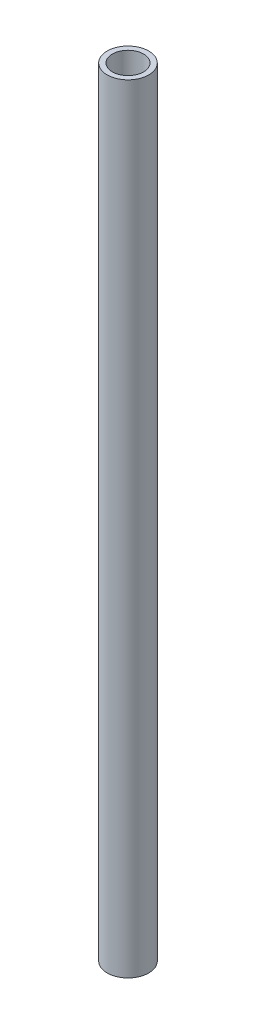
ISO-10303-21;
HEADER;
FILE_DESCRIPTION(('STEP AP214'),'2;1');
FILE_NAME('part.step','',(''),(''),'','','');
FILE_SCHEMA(('AUTOMOTIVE_DESIGN { 1 0 10303 214 1 1 1 1 }'));
ENDSEC;
DATA;
#1=APPLICATION_CONTEXT('core data for automotive mechanical design processes');
#2=APPLICATION_PROTOCOL_DEFINITION('international standard','automotive_design',2000,#1);
#3=PRODUCT_CONTEXT('',#1,'mechanical');
#4=PRODUCT('Part','Part','',(#3));
#5=PRODUCT_RELATED_PRODUCT_CATEGORY('part','',(#4));
#6=PRODUCT_DEFINITION_FORMATION('','',#4);
#7=PRODUCT_DEFINITION_CONTEXT('part definition',#1,'design');
#8=PRODUCT_DEFINITION('design','',#6,#7);
#9=PRODUCT_DEFINITION_SHAPE('','',#8);
#10=(LENGTH_UNIT() NAMED_UNIT(*) SI_UNIT(.MILLI.,.METRE.));
#11=(NAMED_UNIT(*) PLANE_ANGLE_UNIT() SI_UNIT($,.RADIAN.));
#12=(NAMED_UNIT(*) SI_UNIT($,.STERADIAN.) SOLID_ANGLE_UNIT());
#13=UNCERTAINTY_MEASURE_WITH_UNIT(LENGTH_MEASURE(1.E-05),#10,'distance_accuracy_value','');
#14=(GEOMETRIC_REPRESENTATION_CONTEXT(3) GLOBAL_UNCERTAINTY_ASSIGNED_CONTEXT((#13)) GLOBAL_UNIT_ASSIGNED_CONTEXT((#10,
#11,#12)) REPRESENTATION_CONTEXT('',''));
#15=CARTESIAN_POINT('',(0.,0.,0.));
#16=DIRECTION('',(0.,0.,1.));
#17=DIRECTION('',(1.,0.,0.));
#18=AXIS2_PLACEMENT_3D('',#15,#16,#17);
#19=CARTESIAN_POINT('',(0.,0.,0.));
#20=DIRECTION('',(0.,1.,0.));
#21=DIRECTION('',(0.,0.,1.));
#22=AXIS2_PLACEMENT_3D('',#19,#20,#21);
#23=CYLINDRICAL_SURFACE('',#22,4.);
#24=CARTESIAN_POINT('',(0.,150.,0.));
#25=DIRECTION('',(0.,1.,0.));
#26=DIRECTION('',(0.,0.,1.));
#27=AXIS2_PLACEMENT_3D('',#24,#25,#26);
#28=CIRCLE('',#27,4.);
#29=CARTESIAN_POINT('',(0.,150.,4.));
#30=VERTEX_POINT('',#29);
#31=EDGE_CURVE('E50',#30,#30,#28,.T.);
#32=ORIENTED_EDGE('',*,*,#31,.F.);
#33=EDGE_LOOP('',(#32));
#34=FACE_BOUND('',#33,.T.);
#35=CARTESIAN_POINT('',(0.,0.,0.));
#36=DIRECTION('',(0.,1.,0.));
#37=DIRECTION('',(0.,0.,1.));
#38=AXIS2_PLACEMENT_3D('',#35,#36,#37);
#39=CIRCLE('',#38,4.);
#40=CARTESIAN_POINT('',(0.,0.,4.));
#41=VERTEX_POINT('',#40);
#42=EDGE_CURVE('E35',#41,#41,#39,.T.);
#43=ORIENTED_EDGE('',*,*,#42,.T.);
#44=EDGE_LOOP('',(#43));
#45=FACE_BOUND('',#44,.T.);
#46=ADVANCED_FACE('F32',(#34,#45),#23,.T.);
#47=CARTESIAN_POINT('',(0.,0.,0.));
#48=DIRECTION('',(0.,1.,0.));
#49=DIRECTION('',(0.,0.,1.));
#50=AXIS2_PLACEMENT_3D('',#47,#48,#49);
#51=PLANE('',#50);
#52=CARTESIAN_POINT('',(0.,0.,0.));
#53=DIRECTION('',(0.,1.,0.));
#54=DIRECTION('',(0.,0.,1.));
#55=AXIS2_PLACEMENT_3D('',#52,#53,#54);
#56=CIRCLE('',#55,3.);
#57=CARTESIAN_POINT('',(0.,0.,3.));
#58=VERTEX_POINT('',#57);
#59=EDGE_CURVE('E40',#58,#58,#56,.F.);
#60=ORIENTED_EDGE('',*,*,#59,.F.);
#61=EDGE_LOOP('',(#60));
#62=FACE_BOUND('',#61,.T.);
#63=ORIENTED_EDGE('',*,*,#42,.F.);
#64=EDGE_LOOP('',(#63));
#65=FACE_BOUND('',#64,.T.);
#66=ADVANCED_FACE('F68',(#62,#65),#51,.F.);
#67=CARTESIAN_POINT('',(0.,150.,0.));
#68=DIRECTION('',(0.,1.,0.));
#69=DIRECTION('',(0.,0.,1.));
#70=AXIS2_PLACEMENT_3D('',#67,#68,#69);
#71=PLANE('',#70);
#72=CARTESIAN_POINT('',(0.,150.,0.));
#73=DIRECTION('',(0.,1.,0.));
#74=DIRECTION('',(0.,0.,1.));
#75=AXIS2_PLACEMENT_3D('',#72,#73,#74);
#76=CIRCLE('',#75,3.);
#77=CARTESIAN_POINT('',(0.,150.,3.));
#78=VERTEX_POINT('',#77);
#79=EDGE_CURVE('E11',#78,#78,#76,.F.);
#80=ORIENTED_EDGE('',*,*,#79,.T.);
#81=EDGE_LOOP('',(#80));
#82=FACE_BOUND('',#81,.T.);
#83=ORIENTED_EDGE('',*,*,#31,.T.);
#84=EDGE_LOOP('',(#83));
#85=FACE_BOUND('',#84,.T.);
#86=ADVANCED_FACE('F57',(#82,#85),#71,.T.);
#87=CARTESIAN_POINT('',(0.,0.,0.));
#88=DIRECTION('',(0.,1.,0.));
#89=DIRECTION('',(0.,0.,1.));
#90=AXIS2_PLACEMENT_3D('',#87,#88,#89);
#91=CYLINDRICAL_SURFACE('',#90,3.);
#92=ORIENTED_EDGE('',*,*,#79,.F.);
#93=EDGE_LOOP('',(#92));
#94=FACE_BOUND('',#93,.T.);
#95=ORIENTED_EDGE('',*,*,#59,.T.);
#96=EDGE_LOOP('',(#95));
#97=FACE_BOUND('',#96,.T.);
#98=ADVANCED_FACE('F60',(#94,#97),#91,.F.);
#99=CLOSED_SHELL('',(#46,#66,#86,#98));
#100=MANIFOLD_SOLID_BREP('B2',#99);
#101=ADVANCED_BREP_SHAPE_REPRESENTATION('',(#18,#100),#14);
#102=SHAPE_DEFINITION_REPRESENTATION(#9,#101);
ENDSEC;
END-ISO-10303-21;
